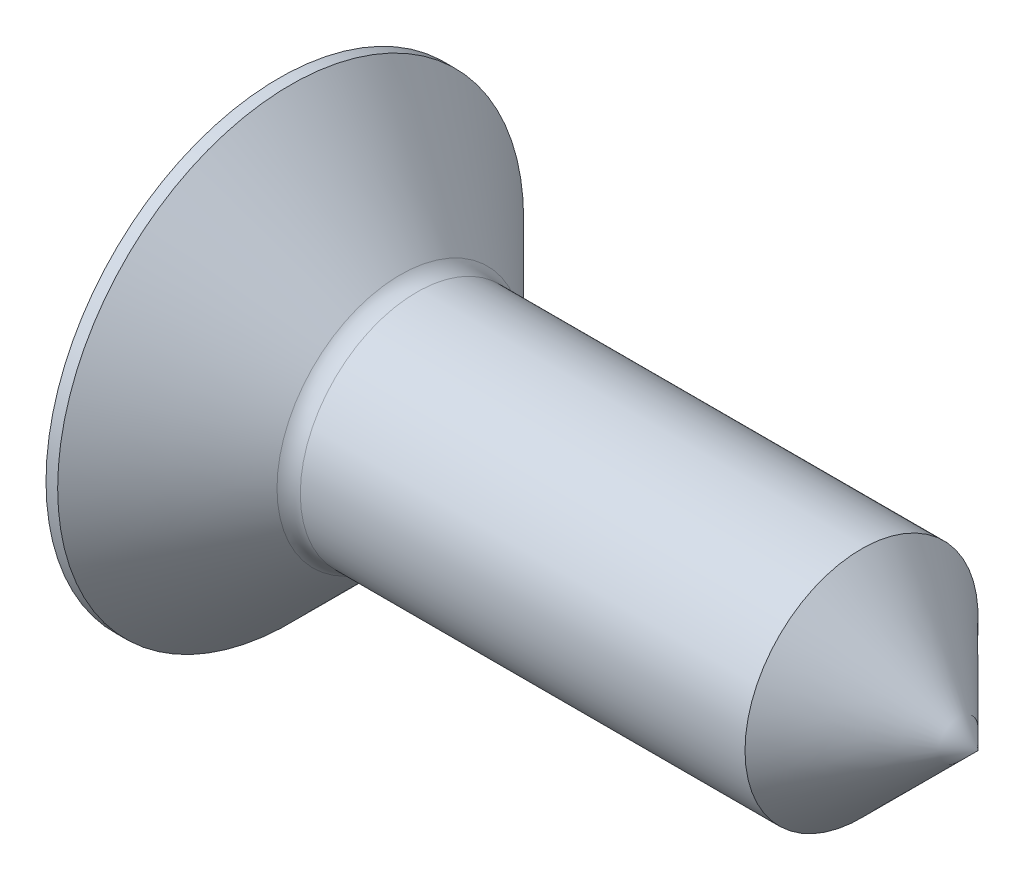
ISO-10303-21;
HEADER;
FILE_DESCRIPTION(('STEP AP214'),'2;1');
FILE_NAME('part.step','',(''),(''),'','','');
FILE_SCHEMA(('AUTOMOTIVE_DESIGN { 1 0 10303 214 1 1 1 1 }'));
ENDSEC;
DATA;
#1=APPLICATION_CONTEXT('core data for automotive mechanical design processes');
#2=APPLICATION_PROTOCOL_DEFINITION('international standard','automotive_design',2000,#1);
#3=PRODUCT_CONTEXT('',#1,'mechanical');
#4=PRODUCT('Part','Part','',(#3));
#5=PRODUCT_RELATED_PRODUCT_CATEGORY('part','',(#4));
#6=PRODUCT_DEFINITION_FORMATION('','',#4);
#7=PRODUCT_DEFINITION_CONTEXT('part definition',#1,'design');
#8=PRODUCT_DEFINITION('design','',#6,#7);
#9=PRODUCT_DEFINITION_SHAPE('','',#8);
#10=(LENGTH_UNIT() NAMED_UNIT(*) SI_UNIT(.MILLI.,.METRE.));
#11=(NAMED_UNIT(*) PLANE_ANGLE_UNIT() SI_UNIT($,.RADIAN.));
#12=(NAMED_UNIT(*) SI_UNIT($,.STERADIAN.) SOLID_ANGLE_UNIT());
#13=UNCERTAINTY_MEASURE_WITH_UNIT(LENGTH_MEASURE(1.E-05),#10,'distance_accuracy_value','');
#14=(GEOMETRIC_REPRESENTATION_CONTEXT(3) GLOBAL_UNCERTAINTY_ASSIGNED_CONTEXT((#13)) GLOBAL_UNIT_ASSIGNED_CONTEXT((#10,
#11,#12)) REPRESENTATION_CONTEXT('',''));
#15=CARTESIAN_POINT('',(0.,0.,0.));
#16=DIRECTION('',(0.,0.,1.));
#17=DIRECTION('',(1.,0.,0.));
#18=AXIS2_PLACEMENT_3D('',#15,#16,#17);
#19=CARTESIAN_POINT('',(-6.50645201269086,0.,0.));
#20=DIRECTION('',(-1.,0.,0.));
#21=DIRECTION('',(0.,0.,1.));
#22=AXIS2_PLACEMENT_3D('',#19,#20,#21);
#23=CYLINDRICAL_SURFACE('',#22,2.);
#24=CARTESIAN_POINT('',(2.36568542494924,0.,0.));
#25=DIRECTION('',(-1.,0.,0.));
#26=DIRECTION('',(0.,0.,1.));
#27=AXIS2_PLACEMENT_3D('',#24,#25,#26);
#28=CIRCLE('',#27,2.);
#29=CARTESIAN_POINT('',(2.36568542494924,0.,2.));
#30=VERTEX_POINT('',#29);
#31=EDGE_CURVE('E12',#30,#30,#28,.F.);
#32=ORIENTED_EDGE('',*,*,#31,.T.);
#33=EDGE_LOOP('',(#32));
#34=FACE_BOUND('',#33,.T.);
#35=CARTESIAN_POINT('',(10.,0.,0.));
#36=DIRECTION('',(-1.,0.,0.));
#37=DIRECTION('',(0.,0.,1.));
#38=AXIS2_PLACEMENT_3D('',#35,#36,#37);
#39=CIRCLE('',#38,2.);
#40=CARTESIAN_POINT('',(10.,0.,2.));
#41=VERTEX_POINT('',#40);
#42=EDGE_CURVE('E127',#41,#41,#39,.F.);
#43=ORIENTED_EDGE('',*,*,#42,.F.);
#44=EDGE_LOOP('',(#43));
#45=FACE_BOUND('',#44,.T.);
#46=ADVANCED_FACE('F48',(#34,#45),#23,.T.);
#47=CARTESIAN_POINT('',(2.2,0.,0.));
#48=DIRECTION('',(-1.,0.,0.));
#49=DIRECTION('',(0.,0.,1.));
#50=AXIS2_PLACEMENT_3D('',#47,#48,#49);
#51=CONICAL_SURFACE('',#50,2.,0.785398163397443);
#52=CARTESIAN_POINT('',(2.08284271247462,0.,0.));
#53=DIRECTION('',(-1.,0.,0.));
#54=DIRECTION('',(0.,0.,1.));
#55=AXIS2_PLACEMENT_3D('',#52,#53,#54);
#56=CIRCLE('',#55,2.11715728752538);
#57=CARTESIAN_POINT('',(2.08284271247462,0.,2.11715728752538));
#58=VERTEX_POINT('',#57);
#59=EDGE_CURVE('E57',#58,#58,#56,.T.);
#60=ORIENTED_EDGE('',*,*,#59,.T.);
#61=EDGE_LOOP('',(#60));
#62=FACE_BOUND('',#61,.T.);
#63=CARTESIAN_POINT('',(0.199999999999979,0.,0.));
#64=DIRECTION('',(-1.,0.,0.));
#65=DIRECTION('',(0.,0.,1.));
#66=AXIS2_PLACEMENT_3D('',#63,#64,#65);
#67=CIRCLE('',#66,4.);
#68=CARTESIAN_POINT('',(0.199999999999979,0.,4.));
#69=VERTEX_POINT('',#68);
#70=EDGE_CURVE('E464',#69,#69,#67,.T.);
#71=ORIENTED_EDGE('',*,*,#70,.F.);
#72=EDGE_LOOP('',(#71));
#73=FACE_BOUND('',#72,.T.);
#74=ADVANCED_FACE('F280',(#62,#73),#51,.T.);
#75=CARTESIAN_POINT('',(-6.50645201269086,0.,0.));
#76=DIRECTION('',(-1.,0.,0.));
#77=DIRECTION('',(0.,0.,1.));
#78=AXIS2_PLACEMENT_3D('',#75,#76,#77);
#79=CYLINDRICAL_SURFACE('',#78,4.);
#80=CARTESIAN_POINT('',(0.,0.,0.));
#81=DIRECTION('',(-1.,0.,0.));
#82=DIRECTION('',(0.,0.,1.));
#83=AXIS2_PLACEMENT_3D('',#80,#81,#82);
#84=CIRCLE('',#83,4.);
#85=CARTESIAN_POINT('',(0.,0.,4.));
#86=VERTEX_POINT('',#85);
#87=EDGE_CURVE('E130',#86,#86,#84,.T.);
#88=ORIENTED_EDGE('',*,*,#87,.F.);
#89=EDGE_LOOP('',(#88));
#90=FACE_BOUND('',#89,.T.);
#91=ORIENTED_EDGE('',*,*,#70,.T.);
#92=EDGE_LOOP('',(#91));
#93=FACE_BOUND('',#92,.T.);
#94=ADVANCED_FACE('F285',(#90,#93),#79,.T.);
#95=CARTESIAN_POINT('',(0.,0.,-4.));
#96=DIRECTION('',(1.,0.,0.));
#97=DIRECTION('',(0.,0.,-1.));
#98=AXIS2_PLACEMENT_3D('',#95,#96,#97);
#99=PLANE('',#98);
#100=DIRECTION('',(0.,0.,-1.));
#101=VECTOR('',#100,1.);
#102=CARTESIAN_POINT('',(0.,0.48,-0.48));
#103=LINE('',#102,#101);
#104=CARTESIAN_POINT('',(0.,0.48,-0.48));
#105=VERTEX_POINT('',#104);
#106=CARTESIAN_POINT('',(0.,0.48,-2.4));
#107=VERTEX_POINT('',#106);
#108=EDGE_CURVE('E109',#105,#107,#103,.T.);
#109=ORIENTED_EDGE('',*,*,#108,.F.);
#110=DIRECTION('',(0.,-1.,0.));
#111=VECTOR('',#110,1.);
#112=CARTESIAN_POINT('',(0.,0.48,-0.48));
#113=LINE('',#112,#111);
#114=CARTESIAN_POINT('',(0.,2.4,-0.48));
#115=VERTEX_POINT('',#114);
#116=EDGE_CURVE('E114',#115,#105,#113,.T.);
#117=ORIENTED_EDGE('',*,*,#116,.F.);
#118=DIRECTION('',(0.,0.,-1.));
#119=VECTOR('',#118,1.);
#120=CARTESIAN_POINT('',(0.,2.4,0.48));
#121=LINE('',#120,#119);
#122=CARTESIAN_POINT('',(0.,2.4,0.48));
#123=VERTEX_POINT('',#122);
#124=EDGE_CURVE('E121',#123,#115,#121,.T.);
#125=ORIENTED_EDGE('',*,*,#124,.F.);
#126=DIRECTION('',(0.,1.,0.));
#127=VECTOR('',#126,1.);
#128=CARTESIAN_POINT('',(0.,0.48,0.48));
#129=LINE('',#128,#127);
#130=CARTESIAN_POINT('',(0.,0.48,0.48));
#131=VERTEX_POINT('',#130);
#132=EDGE_CURVE('E171',#131,#123,#129,.T.);
#133=ORIENTED_EDGE('',*,*,#132,.F.);
#134=DIRECTION('',(0.,0.,-1.));
#135=VECTOR('',#134,1.);
#136=CARTESIAN_POINT('',(0.,0.480000000000001,2.4));
#137=LINE('',#136,#135);
#138=CARTESIAN_POINT('',(0.,0.480000000000001,2.4));
#139=VERTEX_POINT('',#138);
#140=EDGE_CURVE('E169',#139,#131,#137,.T.);
#141=ORIENTED_EDGE('',*,*,#140,.F.);
#142=DIRECTION('',(0.,1.,0.));
#143=VECTOR('',#142,1.);
#144=CARTESIAN_POINT('',(0.,0.480000000000001,2.4));
#145=LINE('',#144,#143);
#146=CARTESIAN_POINT('',(0.,-0.480000000000001,2.4));
#147=VERTEX_POINT('',#146);
#148=EDGE_CURVE('E165',#147,#139,#145,.T.);
#149=ORIENTED_EDGE('',*,*,#148,.F.);
#150=DIRECTION('',(0.,0.,1.));
#151=VECTOR('',#150,1.);
#152=CARTESIAN_POINT('',(0.,-0.480000000000001,2.4));
#153=LINE('',#152,#151);
#154=CARTESIAN_POINT('',(0.,-0.48,0.48));
#155=VERTEX_POINT('',#154);
#156=EDGE_CURVE('E161',#155,#147,#153,.T.);
#157=ORIENTED_EDGE('',*,*,#156,.F.);
#158=DIRECTION('',(0.,1.,0.));
#159=VECTOR('',#158,1.);
#160=CARTESIAN_POINT('',(0.,-2.4,0.480000000000001));
#161=LINE('',#160,#159);
#162=CARTESIAN_POINT('',(0.,-2.4,0.480000000000001));
#163=VERTEX_POINT('',#162);
#164=EDGE_CURVE('E157',#163,#155,#161,.T.);
#165=ORIENTED_EDGE('',*,*,#164,.F.);
#166=DIRECTION('',(0.,0.,1.));
#167=VECTOR('',#166,1.);
#168=CARTESIAN_POINT('',(0.,-2.4,0.480000000000001));
#169=LINE('',#168,#167);
#170=CARTESIAN_POINT('',(0.,-2.4,-0.48));
#171=VERTEX_POINT('',#170);
#172=EDGE_CURVE('E153',#171,#163,#169,.T.);
#173=ORIENTED_EDGE('',*,*,#172,.F.);
#174=DIRECTION('',(0.,-1.,0.));
#175=VECTOR('',#174,1.);
#176=CARTESIAN_POINT('',(0.,-2.4,-0.48));
#177=LINE('',#176,#175);
#178=CARTESIAN_POINT('',(0.,-0.48,-0.48));
#179=VERTEX_POINT('',#178);
#180=EDGE_CURVE('E156',#179,#171,#177,.T.);
#181=ORIENTED_EDGE('',*,*,#180,.F.);
#182=DIRECTION('',(0.,0.,1.));
#183=VECTOR('',#182,1.);
#184=CARTESIAN_POINT('',(0.,-0.48,-0.48));
#185=LINE('',#184,#183);
#186=CARTESIAN_POINT('',(0.,-0.48,-2.4));
#187=VERTEX_POINT('',#186);
#188=EDGE_CURVE('E132',#187,#179,#185,.T.);
#189=ORIENTED_EDGE('',*,*,#188,.F.);
#190=DIRECTION('',(0.,-1.,0.));
#191=VECTOR('',#190,1.);
#192=CARTESIAN_POINT('',(0.,0.48,-2.4));
#193=LINE('',#192,#191);
#194=EDGE_CURVE('E125',#107,#187,#193,.T.);
#195=ORIENTED_EDGE('',*,*,#194,.F.);
#196=EDGE_LOOP('',(#109,#117,#125,#133,#141,#149,#157,#165,#173,#181,#189,#195));
#197=FACE_BOUND('',#196,.T.);
#198=ORIENTED_EDGE('',*,*,#87,.T.);
#199=EDGE_LOOP('',(#198));
#200=FACE_BOUND('',#199,.T.);
#201=ADVANCED_FACE('F122',(#197,#200),#99,.F.);
#202=CARTESIAN_POINT('',(-7.99999999999993,0.,0.));
#203=DIRECTION('',(-1.,0.,0.));
#204=DIRECTION('',(0.,0.,1.));
#205=AXIS2_PLACEMENT_3D('',#202,#203,#204);
#206=CONICAL_SURFACE('',#205,20.,0.78539816339745);
#207=CARTESIAN_POINT('',(12.,0.,0.));
#208=VERTEX_POINT('',#207);
#209=VERTEX_LOOP('',#208);
#210=FACE_BOUND('',#209,.T.);
#211=ORIENTED_EDGE('',*,*,#42,.T.);
#212=EDGE_LOOP('',(#211));
#213=FACE_BOUND('',#212,.T.);
#214=ADVANCED_FACE('F275',(#210,#213),#206,.T.);
#215=CARTESIAN_POINT('',(2.36568542494924,0.,0.));
#216=DIRECTION('',(-1.,0.,0.));
#217=DIRECTION('',(0.,0.,1.));
#218=AXIS2_PLACEMENT_3D('',#215,#216,#217);
#219=TOROIDAL_SURFACE('',#218,2.4,0.4);
#220=ORIENTED_EDGE('',*,*,#31,.F.);
#221=EDGE_LOOP('',(#220));
#222=FACE_BOUND('',#221,.T.);
#223=ORIENTED_EDGE('',*,*,#59,.F.);
#224=EDGE_LOOP('',(#223));
#225=FACE_BOUND('',#224,.T.);
#226=ADVANCED_FACE('F50',(#222,#225),#219,.F.);
#227=CARTESIAN_POINT('',(0.,2.4,-0.48));
#228=DIRECTION('',(0.192263196201913,0.,-0.981343397280597));
#229=DIRECTION('',(-0.981343397280598,0.,-0.192263196201913));
#230=AXIS2_PLACEMENT_3D('',#227,#228,#229);
#231=PLANE('',#230);
#232=DIRECTION('',(0.707463401980538,-0.69302537336869,0.138605074673738));
#233=VECTOR('',#232,1.);
#234=CARTESIAN_POINT('',(0.,2.4,-0.48));
#235=LINE('',#234,#233);
#236=CARTESIAN_POINT('',(2.45,0.,0.));
#237=VERTEX_POINT('',#236);
#238=EDGE_CURVE('E115',#115,#237,#235,.T.);
#239=ORIENTED_EDGE('',*,*,#238,.F.);
#240=ORIENTED_EDGE('',*,*,#116,.T.);
#241=DIRECTION('',(0.963693494125416,-0.188805255991918,0.188805255991918));
#242=VECTOR('',#241,1.);
#243=CARTESIAN_POINT('',(0.,0.48,-0.48));
#244=LINE('',#243,#242);
#245=EDGE_CURVE('E105',#105,#237,#244,.T.);
#246=ORIENTED_EDGE('',*,*,#245,.T.);
#247=EDGE_LOOP('',(#239,#240,#246));
#248=FACE_BOUND('',#247,.T.);
#249=ADVANCED_FACE('F118',(#248),#231,.F.);
#250=CARTESIAN_POINT('',(0.,0.48,-0.48));
#251=DIRECTION('',(0.192263196201913,0.981343397280597,0.));
#252=DIRECTION('',(-0.981343397280598,0.192263196201913,0.));
#253=AXIS2_PLACEMENT_3D('',#250,#251,#252);
#254=PLANE('',#253);
#255=ORIENTED_EDGE('',*,*,#245,.F.);
#256=ORIENTED_EDGE('',*,*,#108,.T.);
#257=DIRECTION('',(0.707463401980538,-0.138605074673738,0.69302537336869));
#258=VECTOR('',#257,1.);
#259=CARTESIAN_POINT('',(0.,0.48,-2.4));
#260=LINE('',#259,#258);
#261=EDGE_CURVE('E65',#107,#237,#260,.T.);
#262=ORIENTED_EDGE('',*,*,#261,.T.);
#263=EDGE_LOOP('',(#255,#256,#262));
#264=FACE_BOUND('',#263,.T.);
#265=ADVANCED_FACE('F107',(#264),#254,.F.);
#266=CARTESIAN_POINT('',(0.,2.4,0.48));
#267=DIRECTION('',(0.699779834816443,0.714358581375119,0.));
#268=DIRECTION('',(-0.714358581375119,0.699779834816443,0.));
#269=AXIS2_PLACEMENT_3D('',#266,#267,#268);
#270=PLANE('',#269);
#271=DIRECTION('',(0.707463401980538,-0.69302537336869,-0.138605074673738));
#272=VECTOR('',#271,1.);
#273=CARTESIAN_POINT('',(0.,2.4,0.48));
#274=LINE('',#273,#272);
#275=EDGE_CURVE('E181',#123,#237,#274,.T.);
#276=ORIENTED_EDGE('',*,*,#275,.F.);
#277=ORIENTED_EDGE('',*,*,#124,.T.);
#278=ORIENTED_EDGE('',*,*,#238,.T.);
#279=EDGE_LOOP('',(#276,#277,#278));
#280=FACE_BOUND('',#279,.T.);
#281=ADVANCED_FACE('F180',(#280),#270,.F.);
#282=CARTESIAN_POINT('',(0.,0.48,0.48));
#283=DIRECTION('',(0.192263196201913,0.,0.981343397280597));
#284=DIRECTION('',(0.981343397280598,0.,-0.192263196201913));
#285=AXIS2_PLACEMENT_3D('',#282,#283,#284);
#286=PLANE('',#285);
#287=DIRECTION('',(0.963693494125416,-0.188805255991918,-0.188805255991918));
#288=VECTOR('',#287,1.);
#289=CARTESIAN_POINT('',(0.,0.48,0.48));
#290=LINE('',#289,#288);
#291=EDGE_CURVE('E332',#131,#237,#290,.T.);
#292=ORIENTED_EDGE('',*,*,#291,.F.);
#293=ORIENTED_EDGE('',*,*,#132,.T.);
#294=ORIENTED_EDGE('',*,*,#275,.T.);
#295=EDGE_LOOP('',(#292,#293,#294));
#296=FACE_BOUND('',#295,.T.);
#297=ADVANCED_FACE('F201',(#296),#286,.F.);
#298=CARTESIAN_POINT('',(0.,0.480000000000001,2.4));
#299=DIRECTION('',(0.192263196201913,0.981343397280598,0.));
#300=DIRECTION('',(-0.981343397280598,0.192263196201913,0.));
#301=AXIS2_PLACEMENT_3D('',#298,#299,#300);
#302=PLANE('',#301);
#303=DIRECTION('',(0.707463401980538,-0.138605074673738,-0.69302537336869));
#304=VECTOR('',#303,1.);
#305=CARTESIAN_POINT('',(0.,0.480000000000001,2.4));
#306=LINE('',#305,#304);
#307=EDGE_CURVE('E230',#139,#237,#306,.T.);
#308=ORIENTED_EDGE('',*,*,#307,.F.);
#309=ORIENTED_EDGE('',*,*,#140,.T.);
#310=ORIENTED_EDGE('',*,*,#291,.T.);
#311=EDGE_LOOP('',(#308,#309,#310));
#312=FACE_BOUND('',#311,.T.);
#313=ADVANCED_FACE('F205',(#312),#302,.F.);
#314=CARTESIAN_POINT('',(0.,-0.480000000000001,2.4));
#315=DIRECTION('',(0.699779834816443,0.,0.714358581375119));
#316=DIRECTION('',(0.714358581375119,0.,-0.699779834816443));
#317=AXIS2_PLACEMENT_3D('',#314,#315,#316);
#318=PLANE('',#317);
#319=DIRECTION('',(0.707463401980538,0.138605074673738,-0.69302537336869));
#320=VECTOR('',#319,1.);
#321=CARTESIAN_POINT('',(0.,-0.480000000000001,2.4));
#322=LINE('',#321,#320);
#323=EDGE_CURVE('E222',#147,#237,#322,.T.);
#324=ORIENTED_EDGE('',*,*,#323,.F.);
#325=ORIENTED_EDGE('',*,*,#148,.T.);
#326=ORIENTED_EDGE('',*,*,#307,.T.);
#327=EDGE_LOOP('',(#324,#325,#326));
#328=FACE_BOUND('',#327,.T.);
#329=ADVANCED_FACE('F208',(#328),#318,.F.);
#330=CARTESIAN_POINT('',(0.,-0.48,0.48));
#331=DIRECTION('',(0.192263196201913,-0.981343397280598,0.));
#332=DIRECTION('',(0.981343397280598,0.192263196201913,0.));
#333=AXIS2_PLACEMENT_3D('',#330,#331,#332);
#334=PLANE('',#333);
#335=DIRECTION('',(0.963693494125416,0.188805255991918,-0.188805255991918));
#336=VECTOR('',#335,1.);
#337=CARTESIAN_POINT('',(0.,-0.48,0.48));
#338=LINE('',#337,#336);
#339=EDGE_CURVE('E231',#155,#237,#338,.T.);
#340=ORIENTED_EDGE('',*,*,#339,.F.);
#341=ORIENTED_EDGE('',*,*,#156,.T.);
#342=ORIENTED_EDGE('',*,*,#323,.T.);
#343=EDGE_LOOP('',(#340,#341,#342));
#344=FACE_BOUND('',#343,.T.);
#345=ADVANCED_FACE('F213',(#344),#334,.F.);
#346=CARTESIAN_POINT('',(0.,-2.4,0.480000000000001));
#347=DIRECTION('',(0.192263196201913,0.,0.981343397280597));
#348=DIRECTION('',(0.981343397280598,0.,-0.192263196201913));
#349=AXIS2_PLACEMENT_3D('',#346,#347,#348);
#350=PLANE('',#349);
#351=DIRECTION('',(0.707463401980538,0.69302537336869,-0.138605074673738));
#352=VECTOR('',#351,1.);
#353=CARTESIAN_POINT('',(0.,-2.4,0.480000000000001));
#354=LINE('',#353,#352);
#355=EDGE_CURVE('E236',#163,#237,#354,.T.);
#356=ORIENTED_EDGE('',*,*,#355,.F.);
#357=ORIENTED_EDGE('',*,*,#164,.T.);
#358=ORIENTED_EDGE('',*,*,#339,.T.);
#359=EDGE_LOOP('',(#356,#357,#358));
#360=FACE_BOUND('',#359,.T.);
#361=ADVANCED_FACE('F264',(#360),#350,.F.);
#362=CARTESIAN_POINT('',(0.,-2.4,-0.48));
#363=DIRECTION('',(0.699779834816443,-0.714358581375119,0.));
#364=DIRECTION('',(0.714358581375119,0.699779834816443,0.));
#365=AXIS2_PLACEMENT_3D('',#362,#363,#364);
#366=PLANE('',#365);
#367=DIRECTION('',(0.707463401980538,0.69302537336869,0.138605074673738));
#368=VECTOR('',#367,1.);
#369=CARTESIAN_POINT('',(0.,-2.4,-0.48));
#370=LINE('',#369,#368);
#371=EDGE_CURVE('E241',#171,#237,#370,.T.);
#372=ORIENTED_EDGE('',*,*,#371,.F.);
#373=ORIENTED_EDGE('',*,*,#172,.T.);
#374=ORIENTED_EDGE('',*,*,#355,.T.);
#375=EDGE_LOOP('',(#372,#373,#374));
#376=FACE_BOUND('',#375,.T.);
#377=ADVANCED_FACE('F254',(#376),#366,.F.);
#378=CARTESIAN_POINT('',(0.,-0.48,-0.48));
#379=DIRECTION('',(0.192263196201913,0.,-0.981343397280598));
#380=DIRECTION('',(-0.981343397280598,0.,-0.192263196201913));
#381=AXIS2_PLACEMENT_3D('',#378,#379,#380);
#382=PLANE('',#381);
#383=DIRECTION('',(0.963693494125416,0.188805255991918,0.188805255991918));
#384=VECTOR('',#383,1.);
#385=CARTESIAN_POINT('',(0.,-0.48,-0.48));
#386=LINE('',#385,#384);
#387=EDGE_CURVE('E321',#179,#237,#386,.T.);
#388=ORIENTED_EDGE('',*,*,#387,.F.);
#389=ORIENTED_EDGE('',*,*,#180,.T.);
#390=ORIENTED_EDGE('',*,*,#371,.T.);
#391=EDGE_LOOP('',(#388,#389,#390));
#392=FACE_BOUND('',#391,.T.);
#393=ADVANCED_FACE('F263',(#392),#382,.F.);
#394=CARTESIAN_POINT('',(0.,-0.48,-2.4));
#395=DIRECTION('',(0.192263196201913,-0.981343397280598,0.));
#396=DIRECTION('',(0.981343397280598,0.192263196201913,0.));
#397=AXIS2_PLACEMENT_3D('',#394,#395,#396);
#398=PLANE('',#397);
#399=DIRECTION('',(0.707463401980538,0.138605074673738,0.69302537336869));
#400=VECTOR('',#399,1.);
#401=CARTESIAN_POINT('',(0.,-0.48,-2.4));
#402=LINE('',#401,#400);
#403=EDGE_CURVE('E343',#187,#237,#402,.T.);
#404=ORIENTED_EDGE('',*,*,#403,.F.);
#405=ORIENTED_EDGE('',*,*,#188,.T.);
#406=ORIENTED_EDGE('',*,*,#387,.T.);
#407=EDGE_LOOP('',(#404,#405,#406));
#408=FACE_BOUND('',#407,.T.);
#409=ADVANCED_FACE('F267',(#408),#398,.F.);
#410=CARTESIAN_POINT('',(0.,0.48,-2.4));
#411=DIRECTION('',(0.699779834816443,0.,-0.714358581375119));
#412=DIRECTION('',(-0.714358581375119,0.,-0.699779834816443));
#413=AXIS2_PLACEMENT_3D('',#410,#411,#412);
#414=PLANE('',#413);
#415=ORIENTED_EDGE('',*,*,#261,.F.);
#416=ORIENTED_EDGE('',*,*,#194,.T.);
#417=ORIENTED_EDGE('',*,*,#403,.T.);
#418=EDGE_LOOP('',(#415,#416,#417));
#419=FACE_BOUND('',#418,.T.);
#420=ADVANCED_FACE('F270',(#419),#414,.F.);
#421=CLOSED_SHELL('',(#46,#74,#94,#201,#214,#226,#249,#265,#281,#297,#313,#329,#345,#361,#377,
#393,#409,#420));
#422=MANIFOLD_SOLID_BREP('B2',#421);
#423=ADVANCED_BREP_SHAPE_REPRESENTATION('',(#18,#422),#14);
#424=SHAPE_DEFINITION_REPRESENTATION(#9,#423);
ENDSEC;
END-ISO-10303-21;
